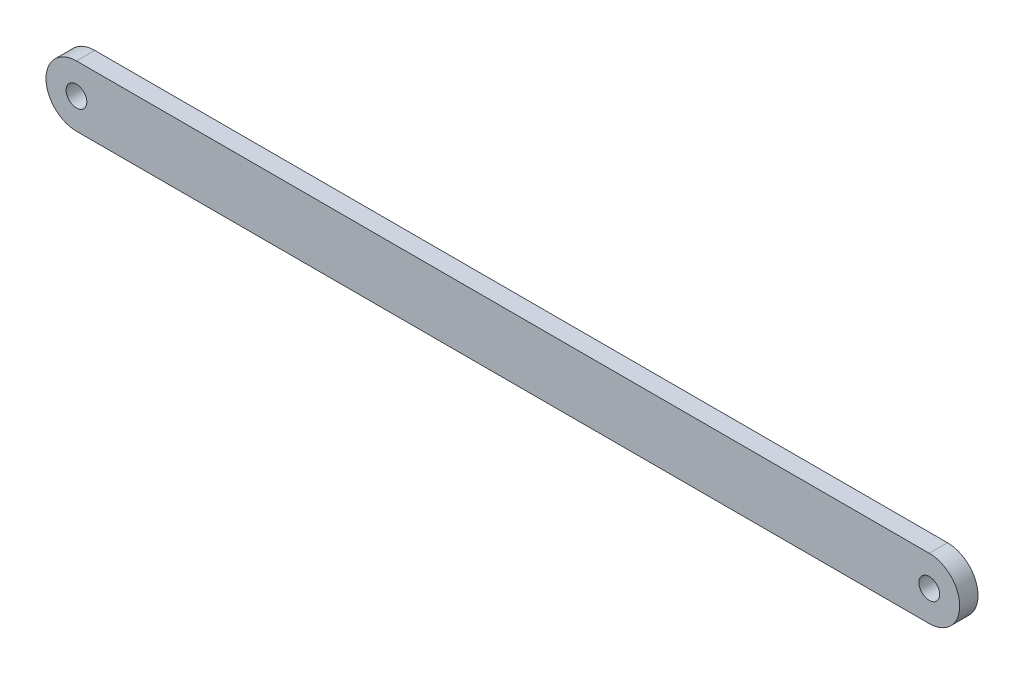
ISO-10303-21;
HEADER;
FILE_DESCRIPTION(('STEP AP214'),'2;1');
FILE_NAME('part.step','',(''),(''),'','','');
FILE_SCHEMA(('AUTOMOTIVE_DESIGN { 1 0 10303 214 1 1 1 1 }'));
ENDSEC;
DATA;
#1=APPLICATION_CONTEXT('core data for automotive mechanical design processes');
#2=APPLICATION_PROTOCOL_DEFINITION('international standard','automotive_design',2000,#1);
#3=PRODUCT_CONTEXT('',#1,'mechanical');
#4=PRODUCT('Part','Part','',(#3));
#5=PRODUCT_RELATED_PRODUCT_CATEGORY('part','',(#4));
#6=PRODUCT_DEFINITION_FORMATION('','',#4);
#7=PRODUCT_DEFINITION_CONTEXT('part definition',#1,'design');
#8=PRODUCT_DEFINITION('design','',#6,#7);
#9=PRODUCT_DEFINITION_SHAPE('','',#8);
#10=(LENGTH_UNIT() NAMED_UNIT(*) SI_UNIT(.MILLI.,.METRE.));
#11=(NAMED_UNIT(*) PLANE_ANGLE_UNIT() SI_UNIT($,.RADIAN.));
#12=(NAMED_UNIT(*) SI_UNIT($,.STERADIAN.) SOLID_ANGLE_UNIT());
#13=UNCERTAINTY_MEASURE_WITH_UNIT(LENGTH_MEASURE(1.E-05),#10,'distance_accuracy_value','');
#14=(GEOMETRIC_REPRESENTATION_CONTEXT(3) GLOBAL_UNCERTAINTY_ASSIGNED_CONTEXT((#13)) GLOBAL_UNIT_ASSIGNED_CONTEXT((#10,
#11,#12)) REPRESENTATION_CONTEXT('',''));
#15=CARTESIAN_POINT('',(0.,0.,0.));
#16=DIRECTION('',(0.,0.,1.));
#17=DIRECTION('',(1.,0.,0.));
#18=AXIS2_PLACEMENT_3D('',#15,#16,#17);
#19=CARTESIAN_POINT('',(-70.,0.,1.5));
#20=DIRECTION('',(0.,0.,-1.));
#21=DIRECTION('',(-1.,0.,0.));
#22=AXIS2_PLACEMENT_3D('',#19,#20,#21);
#23=CYLINDRICAL_SURFACE('',#22,5.);
#24=CARTESIAN_POINT('',(-70.,0.,-1.5));
#25=DIRECTION('',(0.,0.,1.));
#26=DIRECTION('',(1.,0.,0.));
#27=AXIS2_PLACEMENT_3D('',#24,#25,#26);
#28=CIRCLE('',#27,5.);
#29=CARTESIAN_POINT('',(-70.,4.99999999999999,-1.5));
#30=VERTEX_POINT('',#29);
#31=CARTESIAN_POINT('',(-70.,-5.00000000000001,-1.5));
#32=VERTEX_POINT('',#31);
#33=EDGE_CURVE('E111',#30,#32,#28,.T.);
#34=ORIENTED_EDGE('',*,*,#33,.T.);
#35=DIRECTION('',(0.,0.,-1.));
#36=VECTOR('',#35,1.);
#37=CARTESIAN_POINT('',(-70.,-5.00000000000001,1.5));
#38=LINE('',#37,#36);
#39=CARTESIAN_POINT('',(-70.,-5.00000000000001,1.5));
#40=VERTEX_POINT('',#39);
#41=EDGE_CURVE('E11',#40,#32,#38,.T.);
#42=ORIENTED_EDGE('',*,*,#41,.F.);
#43=CARTESIAN_POINT('',(-70.,0.,1.5));
#44=DIRECTION('',(0.,0.,1.));
#45=DIRECTION('',(1.,0.,0.));
#46=AXIS2_PLACEMENT_3D('',#43,#44,#45);
#47=CIRCLE('',#46,5.);
#48=CARTESIAN_POINT('',(-70.,4.99999999999999,1.5));
#49=VERTEX_POINT('',#48);
#50=EDGE_CURVE('E93',#49,#40,#47,.T.);
#51=ORIENTED_EDGE('',*,*,#50,.F.);
#52=DIRECTION('',(0.,0.,-1.));
#53=VECTOR('',#52,1.);
#54=CARTESIAN_POINT('',(-70.,4.99999999999999,1.5));
#55=LINE('',#54,#53);
#56=EDGE_CURVE('E110',#49,#30,#55,.T.);
#57=ORIENTED_EDGE('',*,*,#56,.T.);
#58=EDGE_LOOP('',(#34,#42,#51,#57));
#59=FACE_BOUND('',#58,.T.);
#60=ADVANCED_FACE('F43',(#59),#23,.T.);
#61=CARTESIAN_POINT('',(-70.,-5.00000000000001,1.5));
#62=DIRECTION('',(0.,1.,0.));
#63=DIRECTION('',(0.,0.,1.));
#64=AXIS2_PLACEMENT_3D('',#61,#62,#63);
#65=PLANE('',#64);
#66=DIRECTION('',(1.,0.,0.));
#67=VECTOR('',#66,1.);
#68=CARTESIAN_POINT('',(-70.,-5.00000000000001,-1.5));
#69=LINE('',#68,#67);
#70=CARTESIAN_POINT('',(70.,-4.99999999999999,-1.5));
#71=VERTEX_POINT('',#70);
#72=EDGE_CURVE('E99',#32,#71,#69,.T.);
#73=ORIENTED_EDGE('',*,*,#72,.T.);
#74=DIRECTION('',(0.,0.,-1.));
#75=VECTOR('',#74,1.);
#76=CARTESIAN_POINT('',(70.,-4.99999999999999,1.5));
#77=LINE('',#76,#75);
#78=CARTESIAN_POINT('',(70.,-4.99999999999999,1.5));
#79=VERTEX_POINT('',#78);
#80=EDGE_CURVE('E55',#79,#71,#77,.T.);
#81=ORIENTED_EDGE('',*,*,#80,.F.);
#82=DIRECTION('',(1.,0.,0.));
#83=VECTOR('',#82,1.);
#84=CARTESIAN_POINT('',(-70.,-5.00000000000001,1.5));
#85=LINE('',#84,#83);
#86=EDGE_CURVE('E89',#40,#79,#85,.T.);
#87=ORIENTED_EDGE('',*,*,#86,.F.);
#88=ORIENTED_EDGE('',*,*,#41,.T.);
#89=EDGE_LOOP('',(#73,#81,#87,#88));
#90=FACE_BOUND('',#89,.T.);
#91=ADVANCED_FACE('F100',(#90),#65,.F.);
#92=CARTESIAN_POINT('',(70.,0.,1.5));
#93=DIRECTION('',(0.,0.,-1.));
#94=DIRECTION('',(-1.,0.,0.));
#95=AXIS2_PLACEMENT_3D('',#92,#93,#94);
#96=CYLINDRICAL_SURFACE('',#95,5.);
#97=CARTESIAN_POINT('',(70.,0.,-1.5));
#98=DIRECTION('',(0.,0.,1.));
#99=DIRECTION('',(1.,0.,0.));
#100=AXIS2_PLACEMENT_3D('',#97,#98,#99);
#101=CIRCLE('',#100,5.);
#102=CARTESIAN_POINT('',(70.,4.99999999999999,-1.5));
#103=VERTEX_POINT('',#102);
#104=EDGE_CURVE('E80',#71,#103,#101,.T.);
#105=ORIENTED_EDGE('',*,*,#104,.T.);
#106=DIRECTION('',(0.,0.,-1.));
#107=VECTOR('',#106,1.);
#108=CARTESIAN_POINT('',(70.,4.99999999999999,1.5));
#109=LINE('',#108,#107);
#110=CARTESIAN_POINT('',(70.,4.99999999999999,1.5));
#111=VERTEX_POINT('',#110);
#112=EDGE_CURVE('E105',#111,#103,#109,.T.);
#113=ORIENTED_EDGE('',*,*,#112,.F.);
#114=CARTESIAN_POINT('',(70.,0.,1.5));
#115=DIRECTION('',(0.,0.,1.));
#116=DIRECTION('',(1.,0.,0.));
#117=AXIS2_PLACEMENT_3D('',#114,#115,#116);
#118=CIRCLE('',#117,5.);
#119=EDGE_CURVE('E94',#79,#111,#118,.T.);
#120=ORIENTED_EDGE('',*,*,#119,.F.);
#121=ORIENTED_EDGE('',*,*,#80,.T.);
#122=EDGE_LOOP('',(#105,#113,#120,#121));
#123=FACE_BOUND('',#122,.T.);
#124=ADVANCED_FACE('F101',(#123),#96,.T.);
#125=CARTESIAN_POINT('',(-70.,4.99999999999999,1.5));
#126=DIRECTION('',(0.,-1.,0.));
#127=DIRECTION('',(0.,0.,-1.));
#128=AXIS2_PLACEMENT_3D('',#125,#126,#127);
#129=PLANE('',#128);
#130=DIRECTION('',(-1.,0.,0.));
#131=VECTOR('',#130,1.);
#132=CARTESIAN_POINT('',(-70.,4.99999999999999,-1.5));
#133=LINE('',#132,#131);
#134=EDGE_CURVE('E84',#103,#30,#133,.T.);
#135=ORIENTED_EDGE('',*,*,#134,.T.);
#136=ORIENTED_EDGE('',*,*,#56,.F.);
#137=DIRECTION('',(-1.,0.,0.));
#138=VECTOR('',#137,1.);
#139=CARTESIAN_POINT('',(-70.,4.99999999999999,1.5));
#140=LINE('',#139,#138);
#141=EDGE_CURVE('E58',#111,#49,#140,.T.);
#142=ORIENTED_EDGE('',*,*,#141,.F.);
#143=ORIENTED_EDGE('',*,*,#112,.T.);
#144=EDGE_LOOP('',(#135,#136,#142,#143));
#145=FACE_BOUND('',#144,.T.);
#146=ADVANCED_FACE('F123',(#145),#129,.F.);
#147=CARTESIAN_POINT('',(-70.,0.,1.5));
#148=DIRECTION('',(0.,0.,1.));
#149=DIRECTION('',(1.,0.,0.));
#150=AXIS2_PLACEMENT_3D('',#147,#148,#149);
#151=PLANE('',#150);
#152=CARTESIAN_POINT('',(-70.,0.,1.5));
#153=DIRECTION('',(0.,0.,1.));
#154=DIRECTION('',(1.,0.,0.));
#155=AXIS2_PLACEMENT_3D('',#152,#153,#154);
#156=CIRCLE('',#155,1.69999999999999);
#157=CARTESIAN_POINT('',(-68.3,0.,1.5));
#158=VERTEX_POINT('',#157);
#159=EDGE_CURVE('E141',#158,#158,#156,.T.);
#160=ORIENTED_EDGE('',*,*,#159,.F.);
#161=EDGE_LOOP('',(#160));
#162=FACE_BOUND('',#161,.T.);
#163=CARTESIAN_POINT('',(70.,0.,1.5));
#164=DIRECTION('',(0.,0.,1.));
#165=DIRECTION('',(1.,0.,0.));
#166=AXIS2_PLACEMENT_3D('',#163,#164,#165);
#167=CIRCLE('',#166,1.69999999999999);
#168=CARTESIAN_POINT('',(71.7,0.,1.5));
#169=VERTEX_POINT('',#168);
#170=EDGE_CURVE('E134',#169,#169,#167,.T.);
#171=ORIENTED_EDGE('',*,*,#170,.F.);
#172=EDGE_LOOP('',(#171));
#173=FACE_BOUND('',#172,.T.);
#174=ORIENTED_EDGE('',*,*,#50,.T.);
#175=ORIENTED_EDGE('',*,*,#86,.T.);
#176=ORIENTED_EDGE('',*,*,#119,.T.);
#177=ORIENTED_EDGE('',*,*,#141,.T.);
#178=EDGE_LOOP('',(#174,#175,#176,#177));
#179=FACE_BOUND('',#178,.T.);
#180=ADVANCED_FACE('F92',(#162,#173,#179),#151,.T.);
#181=CARTESIAN_POINT('',(-70.,0.,-1.5));
#182=DIRECTION('',(0.,0.,1.));
#183=DIRECTION('',(1.,0.,0.));
#184=AXIS2_PLACEMENT_3D('',#181,#182,#183);
#185=PLANE('',#184);
#186=CARTESIAN_POINT('',(-70.,0.,-1.5));
#187=DIRECTION('',(0.,0.,1.));
#188=DIRECTION('',(1.,0.,0.));
#189=AXIS2_PLACEMENT_3D('',#186,#187,#188);
#190=CIRCLE('',#189,1.69999999999999);
#191=CARTESIAN_POINT('',(-68.3,0.,-1.5));
#192=VERTEX_POINT('',#191);
#193=EDGE_CURVE('E136',#192,#192,#190,.T.);
#194=ORIENTED_EDGE('',*,*,#193,.T.);
#195=EDGE_LOOP('',(#194));
#196=FACE_BOUND('',#195,.T.);
#197=CARTESIAN_POINT('',(70.,0.,-1.5));
#198=DIRECTION('',(0.,0.,1.));
#199=DIRECTION('',(1.,0.,0.));
#200=AXIS2_PLACEMENT_3D('',#197,#198,#199);
#201=CIRCLE('',#200,1.69999999999999);
#202=CARTESIAN_POINT('',(71.7,0.,-1.5));
#203=VERTEX_POINT('',#202);
#204=EDGE_CURVE('E114',#203,#203,#201,.T.);
#205=ORIENTED_EDGE('',*,*,#204,.T.);
#206=EDGE_LOOP('',(#205));
#207=FACE_BOUND('',#206,.T.);
#208=ORIENTED_EDGE('',*,*,#33,.F.);
#209=ORIENTED_EDGE('',*,*,#134,.F.);
#210=ORIENTED_EDGE('',*,*,#104,.F.);
#211=ORIENTED_EDGE('',*,*,#72,.F.);
#212=EDGE_LOOP('',(#208,#209,#210,#211));
#213=FACE_BOUND('',#212,.T.);
#214=ADVANCED_FACE('F129',(#196,#207,#213),#185,.F.);
#215=CARTESIAN_POINT('',(70.,0.,1.5));
#216=DIRECTION('',(0.,0.,1.));
#217=DIRECTION('',(1.,0.,0.));
#218=AXIS2_PLACEMENT_3D('',#215,#216,#217);
#219=CYLINDRICAL_SURFACE('',#218,1.69999999999999);
#220=ORIENTED_EDGE('',*,*,#204,.F.);
#221=EDGE_LOOP('',(#220));
#222=FACE_BOUND('',#221,.T.);
#223=ORIENTED_EDGE('',*,*,#170,.T.);
#224=EDGE_LOOP('',(#223));
#225=FACE_BOUND('',#224,.T.);
#226=ADVANCED_FACE('F154',(#222,#225),#219,.F.);
#227=CARTESIAN_POINT('',(-70.,0.,1.5));
#228=DIRECTION('',(0.,0.,1.));
#229=DIRECTION('',(1.,0.,0.));
#230=AXIS2_PLACEMENT_3D('',#227,#228,#229);
#231=CYLINDRICAL_SURFACE('',#230,1.69999999999999);
#232=ORIENTED_EDGE('',*,*,#193,.F.);
#233=EDGE_LOOP('',(#232));
#234=FACE_BOUND('',#233,.T.);
#235=ORIENTED_EDGE('',*,*,#159,.T.);
#236=EDGE_LOOP('',(#235));
#237=FACE_BOUND('',#236,.T.);
#238=ADVANCED_FACE('F149',(#234,#237),#231,.F.);
#239=CLOSED_SHELL('',(#60,#91,#124,#146,#180,#214,#226,#238));
#240=MANIFOLD_SOLID_BREP('B2',#239);
#241=ADVANCED_BREP_SHAPE_REPRESENTATION('',(#18,#240),#14);
#242=SHAPE_DEFINITION_REPRESENTATION(#9,#241);
ENDSEC;
END-ISO-10303-21;
